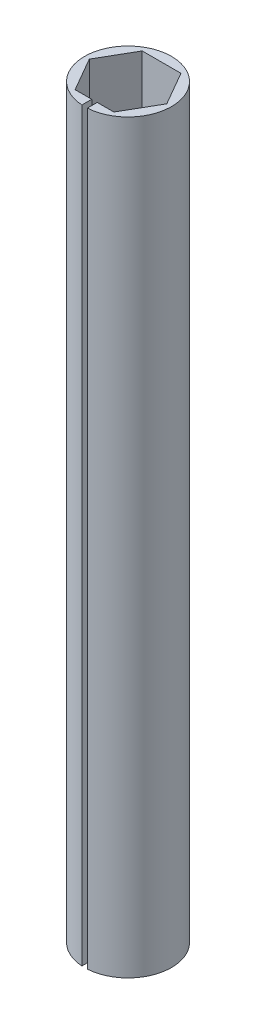
ISO-10303-21;
HEADER;
FILE_DESCRIPTION(('STEP AP214'),'2;1');
FILE_NAME('part.step','',(''),(''),'','','');
FILE_SCHEMA(('AUTOMOTIVE_DESIGN { 1 0 10303 214 1 1 1 1 }'));
ENDSEC;
DATA;
#1=APPLICATION_CONTEXT('core data for automotive mechanical design processes');
#2=APPLICATION_PROTOCOL_DEFINITION('international standard','automotive_design',2000,#1);
#3=PRODUCT_CONTEXT('',#1,'mechanical');
#4=PRODUCT('Part','Part','',(#3));
#5=PRODUCT_RELATED_PRODUCT_CATEGORY('part','',(#4));
#6=PRODUCT_DEFINITION_FORMATION('','',#4);
#7=PRODUCT_DEFINITION_CONTEXT('part definition',#1,'design');
#8=PRODUCT_DEFINITION('design','',#6,#7);
#9=PRODUCT_DEFINITION_SHAPE('','',#8);
#10=(LENGTH_UNIT() NAMED_UNIT(*) SI_UNIT(.MILLI.,.METRE.));
#11=(NAMED_UNIT(*) PLANE_ANGLE_UNIT() SI_UNIT($,.RADIAN.));
#12=(NAMED_UNIT(*) SI_UNIT($,.STERADIAN.) SOLID_ANGLE_UNIT());
#13=UNCERTAINTY_MEASURE_WITH_UNIT(LENGTH_MEASURE(1.E-05),#10,'distance_accuracy_value','');
#14=(GEOMETRIC_REPRESENTATION_CONTEXT(3) GLOBAL_UNCERTAINTY_ASSIGNED_CONTEXT((#13)) GLOBAL_UNIT_ASSIGNED_CONTEXT((#10,
#11,#12)) REPRESENTATION_CONTEXT('',''));
#15=CARTESIAN_POINT('',(0.,0.,0.));
#16=DIRECTION('',(0.,0.,1.));
#17=DIRECTION('',(1.,0.,0.));
#18=AXIS2_PLACEMENT_3D('',#15,#16,#17);
#19=CARTESIAN_POINT('',(-3.95946814610246,152.4,6.858));
#20=DIRECTION('',(0.,0.,-1.));
#21=DIRECTION('',(-1.,0.,0.));
#22=AXIS2_PLACEMENT_3D('',#19,#20,#21);
#23=PLANE('',#22);
#24=DIRECTION('',(0.,-1.,0.));
#25=VECTOR('',#24,1.);
#26=CARTESIAN_POINT('',(0.556625777762497,152.4,6.858));
#27=LINE('',#26,#25);
#28=CARTESIAN_POINT('',(0.556625777762498,152.4,6.858));
#29=VERTEX_POINT('',#28);
#30=CARTESIAN_POINT('',(0.556625777762498,0.,6.858));
#31=VERTEX_POINT('',#30);
#32=EDGE_CURVE('E11',#29,#31,#27,.T.);
#33=ORIENTED_EDGE('',*,*,#32,.F.);
#34=DIRECTION('',(1.,0.,0.));
#35=VECTOR('',#34,1.);
#36=CARTESIAN_POINT('',(-3.95946814610246,152.4,6.858));
#37=LINE('',#36,#35);
#38=CARTESIAN_POINT('',(3.95946814610245,152.4,6.858));
#39=VERTEX_POINT('',#38);
#40=EDGE_CURVE('E153',#29,#39,#37,.T.);
#41=ORIENTED_EDGE('',*,*,#40,.T.);
#42=DIRECTION('',(0.,-1.,0.));
#43=VECTOR('',#42,1.);
#44=CARTESIAN_POINT('',(3.95946814610245,152.4,6.858));
#45=LINE('',#44,#43);
#46=CARTESIAN_POINT('',(3.95946814610245,0.,6.858));
#47=VERTEX_POINT('',#46);
#48=EDGE_CURVE('E128',#39,#47,#45,.T.);
#49=ORIENTED_EDGE('',*,*,#48,.T.);
#50=DIRECTION('',(1.,0.,0.));
#51=VECTOR('',#50,1.);
#52=CARTESIAN_POINT('',(-3.95946814610246,0.,6.858));
#53=LINE('',#52,#51);
#54=EDGE_CURVE('E121',#31,#47,#53,.T.);
#55=ORIENTED_EDGE('',*,*,#54,.F.);
#56=EDGE_LOOP('',(#33,#41,#49,#55));
#57=FACE_BOUND('',#56,.T.);
#58=ADVANCED_FACE('F37',(#57),#23,.T.);
#59=CARTESIAN_POINT('',(0.,152.4,0.));
#60=DIRECTION('',(0.,1.,0.));
#61=DIRECTION('',(0.,0.,1.));
#62=AXIS2_PLACEMENT_3D('',#59,#60,#61);
#63=PLANE('',#62);
#64=DIRECTION('',(0.,0.,1.));
#65=VECTOR('',#64,1.);
#66=CARTESIAN_POINT('',(0.556625777762498,152.4,4.04678860358784));
#67=LINE('',#66,#65);
#68=CARTESIAN_POINT('',(0.556625777762498,152.4,8.87255700142469));
#69=VERTEX_POINT('',#68);
#70=EDGE_CURVE('E51',#29,#69,#67,.T.);
#71=ORIENTED_EDGE('',*,*,#70,.T.);
#72=CARTESIAN_POINT('',(0.,152.4,0.));
#73=DIRECTION('',(0.,1.,0.));
#74=DIRECTION('',(0.,0.,1.));
#75=AXIS2_PLACEMENT_3D('',#72,#73,#74);
#76=CIRCLE('',#75,8.89);
#77=CARTESIAN_POINT('',(-0.556625777762498,152.4,8.87255700142469));
#78=VERTEX_POINT('',#77);
#79=EDGE_CURVE('E166',#69,#78,#76,.T.);
#80=ORIENTED_EDGE('',*,*,#79,.T.);
#81=DIRECTION('',(0.,0.,-1.));
#82=VECTOR('',#81,1.);
#83=CARTESIAN_POINT('',(-0.556625777762498,152.4,4.04678860358784));
#84=LINE('',#83,#82);
#85=CARTESIAN_POINT('',(-0.556625777762498,152.4,6.858));
#86=VERTEX_POINT('',#85);
#87=EDGE_CURVE('E171',#78,#86,#84,.T.);
#88=ORIENTED_EDGE('',*,*,#87,.T.);
#89=CARTESIAN_POINT('',(-3.95946814610246,152.4,6.858));
#90=VERTEX_POINT('',#89);
#91=EDGE_CURVE('E179',#90,#86,#37,.T.);
#92=ORIENTED_EDGE('',*,*,#91,.F.);
#93=DIRECTION('',(0.5,0.,0.866025403784439));
#94=VECTOR('',#93,1.);
#95=CARTESIAN_POINT('',(-7.91893629220491,152.4,0.));
#96=LINE('',#95,#94);
#97=CARTESIAN_POINT('',(-7.91893629220491,152.4,0.));
#98=VERTEX_POINT('',#97);
#99=EDGE_CURVE('E138',#98,#90,#96,.T.);
#100=ORIENTED_EDGE('',*,*,#99,.F.);
#101=DIRECTION('',(-0.5,0.,0.866025403784439));
#102=VECTOR('',#101,1.);
#103=CARTESIAN_POINT('',(-3.95946814610245,152.4,-6.858));
#104=LINE('',#103,#102);
#105=CARTESIAN_POINT('',(-3.95946814610245,152.4,-6.858));
#106=VERTEX_POINT('',#105);
#107=EDGE_CURVE('E192',#106,#98,#104,.T.);
#108=ORIENTED_EDGE('',*,*,#107,.F.);
#109=DIRECTION('',(-1.,0.,0.));
#110=VECTOR('',#109,1.);
#111=CARTESIAN_POINT('',(3.95946814610245,152.4,-6.858));
#112=LINE('',#111,#110);
#113=CARTESIAN_POINT('',(3.95946814610245,152.4,-6.858));
#114=VERTEX_POINT('',#113);
#115=EDGE_CURVE('E191',#114,#106,#112,.T.);
#116=ORIENTED_EDGE('',*,*,#115,.F.);
#117=DIRECTION('',(-0.5,0.,-0.866025403784439));
#118=VECTOR('',#117,1.);
#119=CARTESIAN_POINT('',(7.91893629220491,152.4,0.));
#120=LINE('',#119,#118);
#121=CARTESIAN_POINT('',(7.91893629220491,152.4,0.));
#122=VERTEX_POINT('',#121);
#123=EDGE_CURVE('E186',#122,#114,#120,.T.);
#124=ORIENTED_EDGE('',*,*,#123,.F.);
#125=DIRECTION('',(0.5,0.,-0.866025403784439));
#126=VECTOR('',#125,1.);
#127=CARTESIAN_POINT('',(3.95946814610245,152.4,6.858));
#128=LINE('',#127,#126);
#129=EDGE_CURVE('E184',#39,#122,#128,.T.);
#130=ORIENTED_EDGE('',*,*,#129,.F.);
#131=ORIENTED_EDGE('',*,*,#40,.F.);
#132=EDGE_LOOP('',(#71,#80,#88,#92,#100,#108,#116,#124,#130,#131));
#133=FACE_BOUND('',#132,.T.);
#134=ADVANCED_FACE('F177',(#133),#63,.T.);
#135=CARTESIAN_POINT('',(0.,0.,0.));
#136=DIRECTION('',(0.,1.,0.));
#137=DIRECTION('',(0.,0.,1.));
#138=AXIS2_PLACEMENT_3D('',#135,#136,#137);
#139=PLANE('',#138);
#140=CARTESIAN_POINT('',(0.,0.,0.));
#141=DIRECTION('',(0.,1.,0.));
#142=DIRECTION('',(0.,0.,1.));
#143=AXIS2_PLACEMENT_3D('',#140,#141,#142);
#144=CIRCLE('',#143,8.89);
#145=CARTESIAN_POINT('',(0.556625777762498,0.,8.87255700142469));
#146=VERTEX_POINT('',#145);
#147=CARTESIAN_POINT('',(-0.556625777762498,0.,8.87255700142469));
#148=VERTEX_POINT('',#147);
#149=EDGE_CURVE('E124',#146,#148,#144,.T.);
#150=ORIENTED_EDGE('',*,*,#149,.F.);
#151=DIRECTION('',(0.,0.,1.));
#152=VECTOR('',#151,1.);
#153=CARTESIAN_POINT('',(0.556625777762498,0.,4.04678860358784));
#154=LINE('',#153,#152);
#155=EDGE_CURVE('E112',#31,#146,#154,.T.);
#156=ORIENTED_EDGE('',*,*,#155,.F.);
#157=ORIENTED_EDGE('',*,*,#54,.T.);
#158=DIRECTION('',(0.5,0.,-0.866025403784439));
#159=VECTOR('',#158,1.);
#160=CARTESIAN_POINT('',(3.95946814610245,0.,6.858));
#161=LINE('',#160,#159);
#162=CARTESIAN_POINT('',(7.91893629220491,0.,0.));
#163=VERTEX_POINT('',#162);
#164=EDGE_CURVE('E133',#47,#163,#161,.T.);
#165=ORIENTED_EDGE('',*,*,#164,.T.);
#166=DIRECTION('',(-0.5,0.,-0.866025403784439));
#167=VECTOR('',#166,1.);
#168=CARTESIAN_POINT('',(7.91893629220491,0.,0.));
#169=LINE('',#168,#167);
#170=CARTESIAN_POINT('',(3.95946814610245,0.,-6.858));
#171=VERTEX_POINT('',#170);
#172=EDGE_CURVE('E141',#163,#171,#169,.T.);
#173=ORIENTED_EDGE('',*,*,#172,.T.);
#174=DIRECTION('',(-1.,0.,0.));
#175=VECTOR('',#174,1.);
#176=CARTESIAN_POINT('',(3.95946814610245,0.,-6.858));
#177=LINE('',#176,#175);
#178=CARTESIAN_POINT('',(-3.95946814610245,0.,-6.858));
#179=VERTEX_POINT('',#178);
#180=EDGE_CURVE('E144',#171,#179,#177,.T.);
#181=ORIENTED_EDGE('',*,*,#180,.T.);
#182=DIRECTION('',(-0.5,0.,0.866025403784439));
#183=VECTOR('',#182,1.);
#184=CARTESIAN_POINT('',(-3.95946814610245,0.,-6.858));
#185=LINE('',#184,#183);
#186=CARTESIAN_POINT('',(-7.91893629220491,0.,0.));
#187=VERTEX_POINT('',#186);
#188=EDGE_CURVE('E147',#179,#187,#185,.T.);
#189=ORIENTED_EDGE('',*,*,#188,.T.);
#190=DIRECTION('',(0.5,0.,0.866025403784439));
#191=VECTOR('',#190,1.);
#192=CARTESIAN_POINT('',(-7.91893629220491,0.,0.));
#193=LINE('',#192,#191);
#194=CARTESIAN_POINT('',(-3.95946814610246,0.,6.858));
#195=VERTEX_POINT('',#194);
#196=EDGE_CURVE('E150',#187,#195,#193,.T.);
#197=ORIENTED_EDGE('',*,*,#196,.T.);
#198=CARTESIAN_POINT('',(-0.556625777762498,0.,6.858));
#199=VERTEX_POINT('',#198);
#200=EDGE_CURVE('E129',#195,#199,#53,.T.);
#201=ORIENTED_EDGE('',*,*,#200,.T.);
#202=DIRECTION('',(0.,0.,-1.));
#203=VECTOR('',#202,1.);
#204=CARTESIAN_POINT('',(-0.556625777762498,0.,4.04678860358784));
#205=LINE('',#204,#203);
#206=EDGE_CURVE('E59',#148,#199,#205,.T.);
#207=ORIENTED_EDGE('',*,*,#206,.F.);
#208=EDGE_LOOP('',(#150,#156,#157,#165,#173,#181,#189,#197,#201,#207));
#209=FACE_BOUND('',#208,.T.);
#210=ADVANCED_FACE('F119',(#209),#139,.F.);
#211=CARTESIAN_POINT('',(0.,152.4,0.));
#212=DIRECTION('',(0.,-1.,0.));
#213=DIRECTION('',(0.,0.,-1.));
#214=AXIS2_PLACEMENT_3D('',#211,#212,#213);
#215=CYLINDRICAL_SURFACE('',#214,8.89);
#216=ORIENTED_EDGE('',*,*,#79,.F.);
#217=DIRECTION('',(0.,-1.,0.));
#218=VECTOR('',#217,1.);
#219=CARTESIAN_POINT('',(0.556625777762498,152.4,8.87255700142469));
#220=LINE('',#219,#218);
#221=EDGE_CURVE('E130',#69,#146,#220,.T.);
#222=ORIENTED_EDGE('',*,*,#221,.T.);
#223=ORIENTED_EDGE('',*,*,#149,.T.);
#224=DIRECTION('',(0.,-1.,0.));
#225=VECTOR('',#224,1.);
#226=CARTESIAN_POINT('',(-0.556625777762498,152.4,8.87255700142469));
#227=LINE('',#226,#225);
#228=EDGE_CURVE('E134',#148,#78,#227,.F.);
#229=ORIENTED_EDGE('',*,*,#228,.T.);
#230=EDGE_LOOP('',(#216,#222,#223,#229));
#231=FACE_BOUND('',#230,.T.);
#232=ADVANCED_FACE('F39',(#231),#215,.T.);
#233=DIRECTION('',(0.,1.,0.));
#234=VECTOR('',#233,1.);
#235=CARTESIAN_POINT('',(-0.556625777762498,152.4,6.858));
#236=LINE('',#235,#234);
#237=EDGE_CURVE('E45',#199,#86,#236,.T.);
#238=ORIENTED_EDGE('',*,*,#237,.F.);
#239=ORIENTED_EDGE('',*,*,#200,.F.);
#240=DIRECTION('',(0.,-1.,0.));
#241=VECTOR('',#240,1.);
#242=CARTESIAN_POINT('',(-3.95946814610246,152.4,6.858));
#243=LINE('',#242,#241);
#244=EDGE_CURVE('E154',#90,#195,#243,.T.);
#245=ORIENTED_EDGE('',*,*,#244,.F.);
#246=ORIENTED_EDGE('',*,*,#91,.T.);
#247=EDGE_LOOP('',(#238,#239,#245,#246));
#248=FACE_BOUND('',#247,.T.);
#249=ADVANCED_FACE('F183',(#248),#23,.T.);
#250=CARTESIAN_POINT('',(3.95946814610245,152.4,6.858));
#251=DIRECTION('',(-0.866025403784439,0.,-0.5));
#252=DIRECTION('',(-0.5,0.,0.866025403784438));
#253=AXIS2_PLACEMENT_3D('',#250,#251,#252);
#254=PLANE('',#253);
#255=ORIENTED_EDGE('',*,*,#164,.F.);
#256=ORIENTED_EDGE('',*,*,#48,.F.);
#257=ORIENTED_EDGE('',*,*,#129,.T.);
#258=DIRECTION('',(0.,-1.,0.));
#259=VECTOR('',#258,1.);
#260=CARTESIAN_POINT('',(7.91893629220491,152.4,0.));
#261=LINE('',#260,#259);
#262=EDGE_CURVE('E163',#122,#163,#261,.T.);
#263=ORIENTED_EDGE('',*,*,#262,.T.);
#264=EDGE_LOOP('',(#255,#256,#257,#263));
#265=FACE_BOUND('',#264,.T.);
#266=ADVANCED_FACE('F214',(#265),#254,.T.);
#267=CARTESIAN_POINT('',(7.91893629220491,152.4,0.));
#268=DIRECTION('',(-0.866025403784439,0.,0.5));
#269=DIRECTION('',(0.5,0.,0.866025403784439));
#270=AXIS2_PLACEMENT_3D('',#267,#268,#269);
#271=PLANE('',#270);
#272=ORIENTED_EDGE('',*,*,#172,.F.);
#273=ORIENTED_EDGE('',*,*,#262,.F.);
#274=ORIENTED_EDGE('',*,*,#123,.T.);
#275=DIRECTION('',(0.,-1.,0.));
#276=VECTOR('',#275,1.);
#277=CARTESIAN_POINT('',(3.95946814610245,152.4,-6.858));
#278=LINE('',#277,#276);
#279=EDGE_CURVE('E161',#114,#171,#278,.T.);
#280=ORIENTED_EDGE('',*,*,#279,.T.);
#281=EDGE_LOOP('',(#272,#273,#274,#280));
#282=FACE_BOUND('',#281,.T.);
#283=ADVANCED_FACE('F212',(#282),#271,.T.);
#284=CARTESIAN_POINT('',(3.95946814610245,152.4,-6.858));
#285=DIRECTION('',(0.,0.,1.));
#286=DIRECTION('',(1.,0.,0.));
#287=AXIS2_PLACEMENT_3D('',#284,#285,#286);
#288=PLANE('',#287);
#289=ORIENTED_EDGE('',*,*,#180,.F.);
#290=ORIENTED_EDGE('',*,*,#279,.F.);
#291=ORIENTED_EDGE('',*,*,#115,.T.);
#292=DIRECTION('',(0.,-1.,0.));
#293=VECTOR('',#292,1.);
#294=CARTESIAN_POINT('',(-3.95946814610245,152.4,-6.858));
#295=LINE('',#294,#293);
#296=EDGE_CURVE('E159',#106,#179,#295,.T.);
#297=ORIENTED_EDGE('',*,*,#296,.T.);
#298=EDGE_LOOP('',(#289,#290,#291,#297));
#299=FACE_BOUND('',#298,.T.);
#300=ADVANCED_FACE('F206',(#299),#288,.T.);
#301=CARTESIAN_POINT('',(-3.95946814610245,152.4,-6.858));
#302=DIRECTION('',(0.866025403784439,0.,0.5));
#303=DIRECTION('',(0.5,0.,-0.866025403784438));
#304=AXIS2_PLACEMENT_3D('',#301,#302,#303);
#305=PLANE('',#304);
#306=ORIENTED_EDGE('',*,*,#188,.F.);
#307=ORIENTED_EDGE('',*,*,#296,.F.);
#308=ORIENTED_EDGE('',*,*,#107,.T.);
#309=DIRECTION('',(0.,-1.,0.));
#310=VECTOR('',#309,1.);
#311=CARTESIAN_POINT('',(-7.91893629220491,152.4,0.));
#312=LINE('',#311,#310);
#313=EDGE_CURVE('E157',#98,#187,#312,.T.);
#314=ORIENTED_EDGE('',*,*,#313,.T.);
#315=EDGE_LOOP('',(#306,#307,#308,#314));
#316=FACE_BOUND('',#315,.T.);
#317=ADVANCED_FACE('F208',(#316),#305,.T.);
#318=CARTESIAN_POINT('',(-7.91893629220491,152.4,0.));
#319=DIRECTION('',(0.866025403784439,0.,-0.5));
#320=DIRECTION('',(-0.5,0.,-0.866025403784439));
#321=AXIS2_PLACEMENT_3D('',#318,#319,#320);
#322=PLANE('',#321);
#323=ORIENTED_EDGE('',*,*,#196,.F.);
#324=ORIENTED_EDGE('',*,*,#313,.F.);
#325=ORIENTED_EDGE('',*,*,#99,.T.);
#326=ORIENTED_EDGE('',*,*,#244,.T.);
#327=EDGE_LOOP('',(#323,#324,#325,#326));
#328=FACE_BOUND('',#327,.T.);
#329=ADVANCED_FACE('F199',(#328),#322,.T.);
#330=CARTESIAN_POINT('',(-0.556625777762498,152.4,4.04678860358784));
#331=DIRECTION('',(-1.,0.,0.));
#332=DIRECTION('',(0.,0.,1.));
#333=AXIS2_PLACEMENT_3D('',#330,#331,#332);
#334=PLANE('',#333);
#335=ORIENTED_EDGE('',*,*,#206,.T.);
#336=ORIENTED_EDGE('',*,*,#237,.T.);
#337=ORIENTED_EDGE('',*,*,#87,.F.);
#338=ORIENTED_EDGE('',*,*,#228,.F.);
#339=EDGE_LOOP('',(#335,#336,#337,#338));
#340=FACE_BOUND('',#339,.T.);
#341=ADVANCED_FACE('F170',(#340),#334,.F.);
#342=CARTESIAN_POINT('',(0.556625777762498,152.4,4.04678860358784));
#343=DIRECTION('',(1.,0.,0.));
#344=DIRECTION('',(0.,0.,-1.));
#345=AXIS2_PLACEMENT_3D('',#342,#343,#344);
#346=PLANE('',#345);
#347=ORIENTED_EDGE('',*,*,#70,.F.);
#348=ORIENTED_EDGE('',*,*,#32,.T.);
#349=ORIENTED_EDGE('',*,*,#155,.T.);
#350=ORIENTED_EDGE('',*,*,#221,.F.);
#351=EDGE_LOOP('',(#347,#348,#349,#350));
#352=FACE_BOUND('',#351,.T.);
#353=ADVANCED_FACE('F111',(#352),#346,.F.);
#354=CLOSED_SHELL('',(#58,#134,#210,#232,#249,#266,#283,#300,#317,#329,#341,#353));
#355=MANIFOLD_SOLID_BREP('B2',#354);
#356=ADVANCED_BREP_SHAPE_REPRESENTATION('',(#18,#355),#14);
#357=SHAPE_DEFINITION_REPRESENTATION(#9,#356);
ENDSEC;
END-ISO-10303-21;
